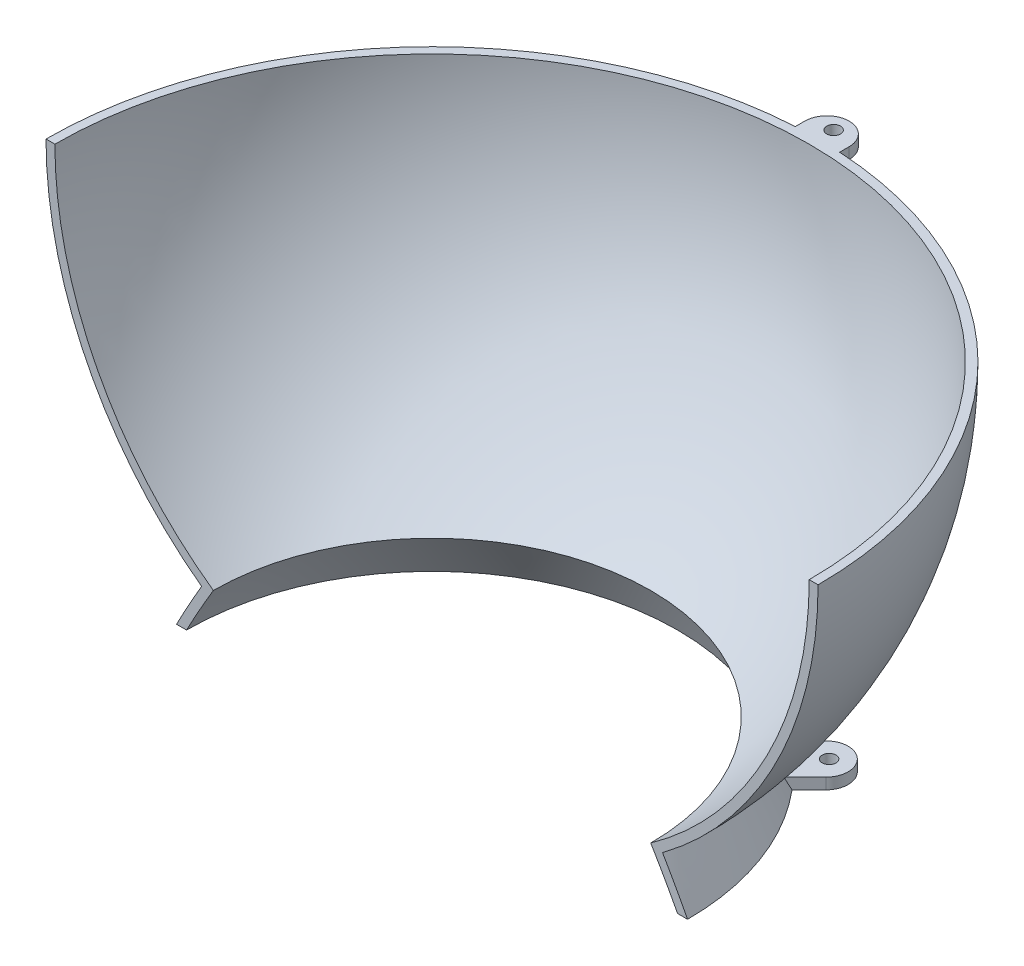
ISO-10303-21;
HEADER;
FILE_DESCRIPTION(('STEP AP214'),'2;1');
FILE_NAME('part.step','',(''),(''),'','','');
FILE_SCHEMA(('AUTOMOTIVE_DESIGN { 1 0 10303 214 1 1 1 1 }'));
ENDSEC;
DATA;
#1=APPLICATION_CONTEXT('core data for automotive mechanical design processes');
#2=APPLICATION_PROTOCOL_DEFINITION('international standard','automotive_design',2000,#1);
#3=PRODUCT_CONTEXT('',#1,'mechanical');
#4=PRODUCT('Part','Part','',(#3));
#5=PRODUCT_RELATED_PRODUCT_CATEGORY('part','',(#4));
#6=PRODUCT_DEFINITION_FORMATION('','',#4);
#7=PRODUCT_DEFINITION_CONTEXT('part definition',#1,'design');
#8=PRODUCT_DEFINITION('design','',#6,#7);
#9=PRODUCT_DEFINITION_SHAPE('','',#8);
#10=(LENGTH_UNIT() NAMED_UNIT(*) SI_UNIT(.MILLI.,.METRE.));
#11=(NAMED_UNIT(*) PLANE_ANGLE_UNIT() SI_UNIT($,.RADIAN.));
#12=(NAMED_UNIT(*) SI_UNIT($,.STERADIAN.) SOLID_ANGLE_UNIT());
#13=UNCERTAINTY_MEASURE_WITH_UNIT(LENGTH_MEASURE(1.E-05),#10,'distance_accuracy_value','');
#14=(GEOMETRIC_REPRESENTATION_CONTEXT(3) GLOBAL_UNCERTAINTY_ASSIGNED_CONTEXT((#13)) GLOBAL_UNIT_ASSIGNED_CONTEXT((#10,
#11,#12)) REPRESENTATION_CONTEXT('',''));
#15=CARTESIAN_POINT('',(0.,0.,0.));
#16=DIRECTION('',(0.,0.,1.));
#17=DIRECTION('',(1.,0.,0.));
#18=AXIS2_PLACEMENT_3D('',#15,#16,#17);
#19=CARTESIAN_POINT('',(0.,0.,0.));
#20=DIRECTION('',(0.,0.,1.));
#21=DIRECTION('',(1.,0.,0.));
#22=AXIS2_PLACEMENT_3D('',#19,#20,#21);
#23=PLANE('',#22);
#24=CARTESIAN_POINT('',(135.,0.,0.));
#25=DIRECTION('',(0.,0.,1.));
#26=DIRECTION('',(1.,0.,0.));
#27=AXIS2_PLACEMENT_3D('',#24,#25,#26);
#28=CIRCLE('',#27,217.);
#29=CARTESIAN_POINT('',(-51.9346598239598,110.201782909808,0.));
#30=VERTEX_POINT('',#29);
#31=CARTESIAN_POINT('',(-57.5850461484482,100.,0.));
#32=VERTEX_POINT('',#31);
#33=EDGE_CURVE('E200',#30,#32,#28,.T.);
#34=ORIENTED_EDGE('',*,*,#33,.T.);
#35=DIRECTION('',(1.,0.,0.));
#36=VECTOR('',#35,1.);
#37=CARTESIAN_POINT('',(6.93889390390723E-13,100.,0.));
#38=LINE('',#37,#36);
#39=CARTESIAN_POINT('',(-55.3286631067424,100.,0.));
#40=VERTEX_POINT('',#39);
#41=EDGE_CURVE('E188',#32,#40,#38,.T.);
#42=ORIENTED_EDGE('',*,*,#41,.T.);
#43=CARTESIAN_POINT('',(135.,0.,0.));
#44=DIRECTION('',(0.,0.,1.));
#45=DIRECTION('',(1.,0.,0.));
#46=AXIS2_PLACEMENT_3D('',#43,#44,#45);
#47=CIRCLE('',#46,215.);
#48=CARTESIAN_POINT('',(-49.2833997941517,110.74578348772,0.));
#49=VERTEX_POINT('',#48);
#50=EDGE_CURVE('E197',#40,#49,#47,.F.);
#51=ORIENTED_EDGE('',*,*,#50,.T.);
#52=CARTESIAN_POINT('',(0.,180.,0.));
#53=DIRECTION('',(0.,0.,1.));
#54=DIRECTION('',(1.,0.,0.));
#55=AXIS2_PLACEMENT_3D('',#52,#53,#54);
#56=CIRCLE('',#55,85.);
#57=CARTESIAN_POINT('',(-85.,180.,0.));
#58=VERTEX_POINT('',#57);
#59=EDGE_CURVE('E214',#49,#58,#56,.F.);
#60=ORIENTED_EDGE('',*,*,#59,.T.);
#61=DIRECTION('',(-1.,0.,0.));
#62=VECTOR('',#61,1.);
#63=CARTESIAN_POINT('',(0.,180.,0.));
#64=LINE('',#63,#62);
#65=CARTESIAN_POINT('',(-87.,180.,0.));
#66=VERTEX_POINT('',#65);
#67=EDGE_CURVE('E440',#58,#66,#64,.T.);
#68=ORIENTED_EDGE('',*,*,#67,.T.);
#69=CARTESIAN_POINT('',(0.,180.,0.));
#70=DIRECTION('',(0.,0.,1.));
#71=DIRECTION('',(1.,0.,0.));
#72=AXIS2_PLACEMENT_3D('',#69,#70,#71);
#73=CIRCLE('',#72,87.);
#74=EDGE_CURVE('E227',#66,#30,#73,.T.);
#75=ORIENTED_EDGE('',*,*,#74,.T.);
#76=EDGE_LOOP('',(#34,#42,#51,#60,#68,#75));
#77=FACE_BOUND('',#76,.T.);
#78=ADVANCED_FACE('F43',(#77),#23,.T.);
#79=CARTESIAN_POINT('',(-135.,0.,0.));
#80=DIRECTION('',(0.,0.,1.));
#81=DIRECTION('',(1.,0.,0.));
#82=AXIS2_PLACEMENT_3D('',#79,#80,#81);
#83=CIRCLE('',#82,215.);
#84=CARTESIAN_POINT('',(49.2833997941517,110.74578348772,0.));
#85=VERTEX_POINT('',#84);
#86=CARTESIAN_POINT('',(55.3286631067432,99.9999999999996,0.));
#87=VERTEX_POINT('',#86);
#88=EDGE_CURVE('E222',#85,#87,#83,.F.);
#89=ORIENTED_EDGE('',*,*,#88,.T.);
#90=CARTESIAN_POINT('',(57.5850461484486,99.9999999999996,0.));
#91=VERTEX_POINT('',#90);
#92=EDGE_CURVE('E58',#87,#91,#38,.T.);
#93=ORIENTED_EDGE('',*,*,#92,.T.);
#94=CARTESIAN_POINT('',(-135.,0.,0.));
#95=DIRECTION('',(0.,0.,1.));
#96=DIRECTION('',(1.,0.,0.));
#97=AXIS2_PLACEMENT_3D('',#94,#95,#96);
#98=CIRCLE('',#97,217.);
#99=CARTESIAN_POINT('',(51.9346598239598,110.201782909808,0.));
#100=VERTEX_POINT('',#99);
#101=EDGE_CURVE('E232',#91,#100,#98,.T.);
#102=ORIENTED_EDGE('',*,*,#101,.T.);
#103=CARTESIAN_POINT('',(87.,180.,0.));
#104=VERTEX_POINT('',#103);
#105=EDGE_CURVE('E228',#100,#104,#73,.T.);
#106=ORIENTED_EDGE('',*,*,#105,.T.);
#107=CARTESIAN_POINT('',(85.,180.,0.));
#108=VERTEX_POINT('',#107);
#109=EDGE_CURVE('E437',#104,#108,#64,.T.);
#110=ORIENTED_EDGE('',*,*,#109,.T.);
#111=EDGE_CURVE('E209',#108,#85,#56,.F.);
#112=ORIENTED_EDGE('',*,*,#111,.T.);
#113=EDGE_LOOP('',(#89,#93,#102,#106,#110,#112));
#114=FACE_BOUND('',#113,.T.);
#115=ADVANCED_FACE('F362',(#114),#23,.T.);
#116=CARTESIAN_POINT('',(44.7431284447289,102.5,-44.7431284447294));
#117=DIRECTION('',(0.,-1.,0.));
#118=DIRECTION('',(1.,0.,0.));
#119=AXIS2_PLACEMENT_3D('',#116,#117,#118);
#120=CYLINDRICAL_SURFACE('',#119,1.55);
#121=CARTESIAN_POINT('',(44.7431284447289,102.5,-44.7431284447294));
#122=DIRECTION('',(0.,-1.,0.));
#123=DIRECTION('',(-1.,0.,0.));
#124=AXIS2_PLACEMENT_3D('',#121,#122,#123);
#125=CIRCLE('',#124,1.55);
#126=CARTESIAN_POINT('',(43.1931284447289,102.5,-44.7431284447294));
#127=VERTEX_POINT('',#126);
#128=EDGE_CURVE('E236',#127,#127,#125,.T.);
#129=ORIENTED_EDGE('',*,*,#128,.F.);
#130=EDGE_LOOP('',(#129));
#131=FACE_BOUND('',#130,.T.);
#132=CARTESIAN_POINT('',(44.7431284447289,99.9999999999997,-44.7431284447294));
#133=DIRECTION('',(0.,-1.,0.));
#134=DIRECTION('',(1.,0.,0.));
#135=AXIS2_PLACEMENT_3D('',#132,#133,#134);
#136=CIRCLE('',#135,1.55);
#137=CARTESIAN_POINT('',(46.2931284447289,99.9999999999997,-44.7431284447294));
#138=VERTEX_POINT('',#137);
#139=EDGE_CURVE('E449',#138,#138,#136,.F.);
#140=ORIENTED_EDGE('',*,*,#139,.F.);
#141=EDGE_LOOP('',(#140));
#142=FACE_BOUND('',#141,.T.);
#143=ADVANCED_FACE('F367',(#131,#142),#120,.F.);
#144=CARTESIAN_POINT('',(44.3895750541356,102.5,-44.3895750541361));
#145=DIRECTION('',(0.,-1.,0.));
#146=DIRECTION('',(1.,0.,0.));
#147=AXIS2_PLACEMENT_3D('',#144,#145,#146);
#148=CYLINDRICAL_SURFACE('',#147,5.);
#149=DIRECTION('',(0.,-1.,0.));
#150=VECTOR('',#149,1.);
#151=CARTESIAN_POINT('',(47.9251089600684,102.5,-47.9251089600689));
#152=LINE('',#151,#150);
#153=CARTESIAN_POINT('',(47.9251089600683,99.9999999999997,-47.9251089600689));
#154=VERTEX_POINT('',#153);
#155=CARTESIAN_POINT('',(47.9251089600684,102.5,-47.9251089600689));
#156=VERTEX_POINT('',#155);
#157=EDGE_CURVE('E241',#154,#156,#152,.F.);
#158=ORIENTED_EDGE('',*,*,#157,.F.);
#159=CARTESIAN_POINT('',(44.3895750541356,99.9999999999997,-44.3895750541361));
#160=DIRECTION('',(0.,-1.,0.));
#161=DIRECTION('',(1.,0.,0.));
#162=AXIS2_PLACEMENT_3D('',#159,#160,#161);
#163=CIRCLE('',#162,5.);
#164=CARTESIAN_POINT('',(40.8540411482029,99.9999999999997,-47.9251089600688));
#165=VERTEX_POINT('',#164);
#166=EDGE_CURVE('E477',#154,#165,#163,.F.);
#167=ORIENTED_EDGE('',*,*,#166,.T.);
#168=DIRECTION('',(0.,-1.,0.));
#169=VECTOR('',#168,1.);
#170=CARTESIAN_POINT('',(40.8540411482029,102.5,-47.9251089600688));
#171=LINE('',#170,#169);
#172=CARTESIAN_POINT('',(40.8540411482029,102.5,-47.9251089600688));
#173=VERTEX_POINT('',#172);
#174=EDGE_CURVE('E413',#173,#165,#171,.T.);
#175=ORIENTED_EDGE('',*,*,#174,.F.);
#176=CARTESIAN_POINT('',(44.3895750541356,102.5,-44.3895750541361));
#177=DIRECTION('',(0.,1.,0.));
#178=DIRECTION('',(-1.,0.,0.));
#179=AXIS2_PLACEMENT_3D('',#176,#177,#178);
#180=CIRCLE('',#179,5.);
#181=EDGE_CURVE('E406',#156,#173,#180,.T.);
#182=ORIENTED_EDGE('',*,*,#181,.F.);
#183=EDGE_LOOP('',(#158,#167,#175,#182));
#184=FACE_BOUND('',#183,.T.);
#185=ADVANCED_FACE('F375',(#184),#148,.T.);
#186=CARTESIAN_POINT('',(44.3895750541356,102.5,-44.3895750541361));
#187=DIRECTION('',(0.,-1.,0.));
#188=DIRECTION('',(1.,0.,0.));
#189=AXIS2_PLACEMENT_3D('',#186,#187,#188);
#190=CYLINDRICAL_SURFACE('',#189,5.);
#191=DIRECTION('',(0.,-1.,0.));
#192=VECTOR('',#191,1.);
#193=CARTESIAN_POINT('',(47.9251089600684,102.5,-40.8540411482034));
#194=LINE('',#193,#192);
#195=CARTESIAN_POINT('',(47.9251089600684,99.9999999999997,-40.8540411482034));
#196=VERTEX_POINT('',#195);
#197=CARTESIAN_POINT('',(47.9251089600684,102.5,-40.8540411482034));
#198=VERTEX_POINT('',#197);
#199=EDGE_CURVE('E403',#196,#198,#194,.F.);
#200=ORIENTED_EDGE('',*,*,#199,.F.);
#201=CARTESIAN_POINT('',(44.3895750541356,99.9999999999997,-44.3895750541361));
#202=DIRECTION('',(0.,-1.,0.));
#203=DIRECTION('',(1.,0.,0.));
#204=AXIS2_PLACEMENT_3D('',#201,#202,#203);
#205=CIRCLE('',#204,5.);
#206=EDGE_CURVE('E480',#196,#154,#205,.F.);
#207=ORIENTED_EDGE('',*,*,#206,.T.);
#208=ORIENTED_EDGE('',*,*,#157,.T.);
#209=CARTESIAN_POINT('',(44.3895750541356,102.5,-44.3895750541361));
#210=DIRECTION('',(0.,1.,0.));
#211=DIRECTION('',(-1.,0.,0.));
#212=AXIS2_PLACEMENT_3D('',#209,#210,#211);
#213=CIRCLE('',#212,5.);
#214=EDGE_CURVE('E409',#198,#156,#213,.T.);
#215=ORIENTED_EDGE('',*,*,#214,.F.);
#216=EDGE_LOOP('',(#200,#207,#208,#215));
#217=FACE_BOUND('',#216,.T.);
#218=ADVANCED_FACE('F541',(#217),#190,.T.);
#219=CARTESIAN_POINT('',(-44.7431284447289,102.5,-44.7431284447294));
#220=DIRECTION('',(0.,-1.,0.));
#221=DIRECTION('',(1.,0.,0.));
#222=AXIS2_PLACEMENT_3D('',#219,#220,#221);
#223=CYLINDRICAL_SURFACE('',#222,1.55);
#224=CARTESIAN_POINT('',(-44.7431284447289,102.5,-44.7431284447294));
#225=DIRECTION('',(0.,-1.,0.));
#226=DIRECTION('',(1.,0.,0.));
#227=AXIS2_PLACEMENT_3D('',#224,#225,#226);
#228=CIRCLE('',#227,1.55);
#229=CARTESIAN_POINT('',(-43.1931284447289,102.5,-44.7431284447294));
#230=VERTEX_POINT('',#229);
#231=EDGE_CURVE('E249',#230,#230,#228,.T.);
#232=ORIENTED_EDGE('',*,*,#231,.F.);
#233=EDGE_LOOP('',(#232));
#234=FACE_BOUND('',#233,.T.);
#235=CARTESIAN_POINT('',(-44.7431284447289,100.,-44.7431284447294));
#236=DIRECTION('',(0.,-1.,0.));
#237=DIRECTION('',(1.,0.,0.));
#238=AXIS2_PLACEMENT_3D('',#235,#236,#237);
#239=CIRCLE('',#238,1.55);
#240=CARTESIAN_POINT('',(-43.1931284447289,100.,-44.7431284447294));
#241=VERTEX_POINT('',#240);
#242=EDGE_CURVE('E497',#241,#241,#239,.F.);
#243=ORIENTED_EDGE('',*,*,#242,.F.);
#244=EDGE_LOOP('',(#243));
#245=FACE_BOUND('',#244,.T.);
#246=ADVANCED_FACE('F544',(#234,#245),#223,.F.);
#247=CARTESIAN_POINT('',(-44.3895750541356,102.5,-44.3895750541361));
#248=DIRECTION('',(0.,-1.,0.));
#249=DIRECTION('',(1.,0.,0.));
#250=AXIS2_PLACEMENT_3D('',#247,#248,#249);
#251=CYLINDRICAL_SURFACE('',#250,5.);
#252=DIRECTION('',(0.,-1.,0.));
#253=VECTOR('',#252,1.);
#254=CARTESIAN_POINT('',(-47.9251089600683,102.5,-47.9251089600689));
#255=LINE('',#254,#253);
#256=CARTESIAN_POINT('',(-47.9251089600683,100.,-47.9251089600689));
#257=VERTEX_POINT('',#256);
#258=CARTESIAN_POINT('',(-47.9251089600683,102.5,-47.9251089600689));
#259=VERTEX_POINT('',#258);
#260=EDGE_CURVE('E235',#257,#259,#255,.F.);
#261=ORIENTED_EDGE('',*,*,#260,.F.);
#262=CARTESIAN_POINT('',(-44.3895750541356,100.,-44.3895750541361));
#263=DIRECTION('',(0.,-1.,0.));
#264=DIRECTION('',(1.,0.,0.));
#265=AXIS2_PLACEMENT_3D('',#262,#263,#264);
#266=CIRCLE('',#265,5.);
#267=CARTESIAN_POINT('',(-47.9251089600684,100.,-40.8540411482034));
#268=VERTEX_POINT('',#267);
#269=EDGE_CURVE('E486',#257,#268,#266,.F.);
#270=ORIENTED_EDGE('',*,*,#269,.T.);
#271=DIRECTION('',(0.,-1.,0.));
#272=VECTOR('',#271,1.);
#273=CARTESIAN_POINT('',(-47.9251089600684,102.5,-40.8540411482034));
#274=LINE('',#273,#272);
#275=CARTESIAN_POINT('',(-47.9251089600684,102.5,-40.8540411482034));
#276=VERTEX_POINT('',#275);
#277=EDGE_CURVE('E425',#276,#268,#274,.T.);
#278=ORIENTED_EDGE('',*,*,#277,.F.);
#279=CARTESIAN_POINT('',(-44.3895750541356,102.5,-44.3895750541361));
#280=DIRECTION('',(0.,1.,0.));
#281=DIRECTION('',(-1.,0.,0.));
#282=AXIS2_PLACEMENT_3D('',#279,#280,#281);
#283=CIRCLE('',#282,5.);
#284=EDGE_CURVE('E66',#259,#276,#283,.T.);
#285=ORIENTED_EDGE('',*,*,#284,.F.);
#286=EDGE_LOOP('',(#261,#270,#278,#285));
#287=FACE_BOUND('',#286,.T.);
#288=ADVANCED_FACE('F45',(#287),#251,.T.);
#289=CARTESIAN_POINT('',(-44.3895750541356,102.5,-44.3895750541361));
#290=DIRECTION('',(0.,-1.,0.));
#291=DIRECTION('',(1.,0.,0.));
#292=AXIS2_PLACEMENT_3D('',#289,#290,#291);
#293=CYLINDRICAL_SURFACE('',#292,5.);
#294=DIRECTION('',(0.,-1.,0.));
#295=VECTOR('',#294,1.);
#296=CARTESIAN_POINT('',(-40.8540411482028,102.5,-47.9251089600688));
#297=LINE('',#296,#295);
#298=CARTESIAN_POINT('',(-40.8540411482029,100.,-47.9251089600688));
#299=VERTEX_POINT('',#298);
#300=CARTESIAN_POINT('',(-40.8540411482028,102.5,-47.9251089600688));
#301=VERTEX_POINT('',#300);
#302=EDGE_CURVE('E417',#299,#301,#297,.F.);
#303=ORIENTED_EDGE('',*,*,#302,.F.);
#304=CARTESIAN_POINT('',(-44.3895750541356,100.,-44.3895750541361));
#305=DIRECTION('',(0.,-1.,0.));
#306=DIRECTION('',(1.,0.,0.));
#307=AXIS2_PLACEMENT_3D('',#304,#305,#306);
#308=CIRCLE('',#307,5.);
#309=EDGE_CURVE('E484',#299,#257,#308,.F.);
#310=ORIENTED_EDGE('',*,*,#309,.T.);
#311=ORIENTED_EDGE('',*,*,#260,.T.);
#312=CARTESIAN_POINT('',(-44.3895750541356,102.5,-44.3895750541361));
#313=DIRECTION('',(0.,1.,0.));
#314=DIRECTION('',(-1.,0.,0.));
#315=AXIS2_PLACEMENT_3D('',#312,#313,#314);
#316=CIRCLE('',#315,5.);
#317=EDGE_CURVE('E422',#301,#259,#316,.T.);
#318=ORIENTED_EDGE('',*,*,#317,.F.);
#319=EDGE_LOOP('',(#303,#310,#311,#318));
#320=FACE_BOUND('',#319,.T.);
#321=ADVANCED_FACE('F547',(#320),#293,.T.);
#322=CARTESIAN_POINT('',(35.9042936798971,102.5,-42.975361491763));
#323=DIRECTION('',(-0.707106781186551,0.,-0.707106781186544));
#324=DIRECTION('',(-0.707106781186544,0.,0.707106781186551));
#325=AXIS2_PLACEMENT_3D('',#322,#323,#324);
#326=PLANE('',#325);
#327=ORIENTED_EDGE('',*,*,#174,.T.);
#328=DIRECTION('',(-0.707106781186544,0.,0.707106781186551));
#329=VECTOR('',#328,1.);
#330=CARTESIAN_POINT('',(35.9042936798971,99.9999999999998,-42.975361491763));
#331=LINE('',#330,#329);
#332=CARTESIAN_POINT('',(37.0294604852894,99.9999999999997,-44.1005282971553));
#333=VERTEX_POINT('',#332);
#334=EDGE_CURVE('E469',#165,#333,#331,.T.);
#335=ORIENTED_EDGE('',*,*,#334,.T.);
#336=CARTESIAN_POINT('',(36.0931834361965,102.5002,-43.1642512480624));
#337=CARTESIAN_POINT('',(36.4080829927804,101.672483120693,-43.4791508046463));
#338=CARTESIAN_POINT('',(36.7191280065031,100.841924679515,-43.790195818369));
#339=CARTESIAN_POINT('',(37.3335089459921,99.1751246794733,-44.404576757858));
#340=CARTESIAN_POINT('',(37.6368448718144,98.338883120652,-44.7079126836804));
#341=CARTESIAN_POINT('',(37.9363262548316,97.4997999999997,-45.0073940666976));
#342=B_SPLINE_CURVE_WITH_KNOTS('',3,(#336,#337,#338,#339,#340,#341),.UNSPECIFIED.,.F.,.F.,(4,2,
4),(0.,2.81956165529873,5.63912329009231),.UNSPECIFIED.);
#343=CARTESIAN_POINT('',(36.0932595253563,102.5,-43.1643273372222));
#344=VERTEX_POINT('',#343);
#345=EDGE_CURVE('E396',#344,#333,#342,.T.);
#346=ORIENTED_EDGE('',*,*,#345,.F.);
#347=DIRECTION('',(0.707106781186544,0.,-0.707106781186551));
#348=VECTOR('',#347,1.);
#349=CARTESIAN_POINT('',(35.9042936798971,102.5,-42.975361491763));
#350=LINE('',#349,#348);
#351=EDGE_CURVE('E240',#344,#173,#350,.T.);
#352=ORIENTED_EDGE('',*,*,#351,.T.);
#353=EDGE_LOOP('',(#327,#335,#346,#352));
#354=FACE_BOUND('',#353,.T.);
#355=ADVANCED_FACE('F383',(#354),#326,.T.);
#356=CARTESIAN_POINT('',(42.9753614917626,102.5,-35.9042936798975));
#357=DIRECTION('',(0.707106781186552,0.,0.707106781186543));
#358=DIRECTION('',(0.707106781186543,0.,-0.707106781186552));
#359=AXIS2_PLACEMENT_3D('',#356,#357,#358);
#360=PLANE('',#359);
#361=CARTESIAN_POINT('',(45.0073940666972,97.4997999999996,-37.9363262548322));
#362=CARTESIAN_POINT('',(44.70791268368,98.3388831206519,-37.6368448718149));
#363=CARTESIAN_POINT('',(44.4045767578576,99.1751246794732,-37.3335089459926));
#364=CARTESIAN_POINT('',(43.7901958183686,100.841924679515,-36.7191280065036));
#365=CARTESIAN_POINT('',(43.4791508046459,101.672483120693,-36.4080829927809));
#366=CARTESIAN_POINT('',(43.164251248062,102.5002,-36.093183436197));
#367=B_SPLINE_CURVE_WITH_KNOTS('',3,(#361,#362,#363,#364,#365,#366),.UNSPECIFIED.,.F.,.F.,(4,2,
4),(0.,2.81956163479357,5.6391232900923),.UNSPECIFIED.);
#368=CARTESIAN_POINT('',(44.1005282971499,99.9999999999997,-37.0294604852849));
#369=VERTEX_POINT('',#368);
#370=CARTESIAN_POINT('',(43.1643273372218,102.5,-36.0932595253568));
#371=VERTEX_POINT('',#370);
#372=EDGE_CURVE('E387',#369,#371,#367,.T.);
#373=ORIENTED_EDGE('',*,*,#372,.F.);
#374=DIRECTION('',(0.707106781186543,0.,-0.707106781186552));
#375=VECTOR('',#374,1.);
#376=CARTESIAN_POINT('',(42.9753614917626,99.9999999999997,-35.9042936798975));
#377=LINE('',#376,#375);
#378=EDGE_CURVE('E565',#369,#196,#377,.T.);
#379=ORIENTED_EDGE('',*,*,#378,.T.);
#380=ORIENTED_EDGE('',*,*,#199,.T.);
#381=DIRECTION('',(-0.707106781186543,0.,0.707106781186552));
#382=VECTOR('',#381,1.);
#383=CARTESIAN_POINT('',(42.9753614917626,102.5,-35.9042936798975));
#384=LINE('',#383,#382);
#385=EDGE_CURVE('E245',#198,#371,#384,.T.);
#386=ORIENTED_EDGE('',*,*,#385,.T.);
#387=EDGE_LOOP('',(#373,#379,#380,#386));
#388=FACE_BOUND('',#387,.T.);
#389=ADVANCED_FACE('F332',(#388),#360,.T.);
#390=CARTESIAN_POINT('',(-42.9753614917626,102.5,-35.9042936798975));
#391=DIRECTION('',(-0.707106781186552,0.,0.707106781186543));
#392=DIRECTION('',(0.707106781186543,0.,0.707106781186552));
#393=AXIS2_PLACEMENT_3D('',#390,#391,#392);
#394=PLANE('',#393);
#395=ORIENTED_EDGE('',*,*,#277,.T.);
#396=DIRECTION('',(0.707106781186543,0.,0.707106781186552));
#397=VECTOR('',#396,1.);
#398=CARTESIAN_POINT('',(-42.9753614917626,100.,-35.9042936798975));
#399=LINE('',#398,#397);
#400=CARTESIAN_POINT('',(-44.1005282971491,100.,-37.0294604852841));
#401=VERTEX_POINT('',#400);
#402=EDGE_CURVE('E562',#268,#401,#399,.T.);
#403=ORIENTED_EDGE('',*,*,#402,.T.);
#404=CARTESIAN_POINT('',(-43.1642512480618,102.5002,-36.0931834361967));
#405=CARTESIAN_POINT('',(-43.4791508046456,101.672483120694,-36.4080829927806));
#406=CARTESIAN_POINT('',(-43.7901958183684,100.841924679515,-36.7191280065033));
#407=CARTESIAN_POINT('',(-44.4045767578574,99.1751246794739,-37.3335089459923));
#408=CARTESIAN_POINT('',(-44.7079126836797,98.3388831206526,-37.6368448718147));
#409=CARTESIAN_POINT('',(-45.007394066697,97.4998000000003,-37.9363262548319));
#410=B_SPLINE_CURVE_WITH_KNOTS('',3,(#404,#405,#406,#407,#408,#409),.UNSPECIFIED.,.F.,.F.,(4,2,
4),(0.,2.81956165529873,5.63912329009229),.UNSPECIFIED.);
#411=CARTESIAN_POINT('',(-43.1643273372216,102.5,-36.0932595253566));
#412=VERTEX_POINT('',#411);
#413=EDGE_CURVE('E304',#412,#401,#410,.T.);
#414=ORIENTED_EDGE('',*,*,#413,.F.);
#415=DIRECTION('',(-0.707106781186543,0.,-0.707106781186552));
#416=VECTOR('',#415,1.);
#417=CARTESIAN_POINT('',(-42.9753614917626,102.5,-35.9042936798975));
#418=LINE('',#417,#416);
#419=EDGE_CURVE('E257',#412,#276,#418,.T.);
#420=ORIENTED_EDGE('',*,*,#419,.T.);
#421=EDGE_LOOP('',(#395,#403,#414,#420));
#422=FACE_BOUND('',#421,.T.);
#423=ADVANCED_FACE('F327',(#422),#394,.T.);
#424=CARTESIAN_POINT('',(-35.904293679897,102.5,-42.975361491763));
#425=DIRECTION('',(0.707106781186551,0.,-0.707106781186544));
#426=DIRECTION('',(-0.707106781186544,0.,-0.707106781186551));
#427=AXIS2_PLACEMENT_3D('',#424,#425,#426);
#428=PLANE('',#427);
#429=CARTESIAN_POINT('',(-37.9363262548315,97.4998000000002,-45.0073940666974));
#430=CARTESIAN_POINT('',(-37.6368448718142,98.3388831206526,-44.7079126836801));
#431=CARTESIAN_POINT('',(-37.3335089459919,99.1751246794738,-44.4045767578578));
#432=CARTESIAN_POINT('',(-36.7191280065028,100.841924679515,-43.7901958183688));
#433=CARTESIAN_POINT('',(-36.4080829927801,101.672483120694,-43.4791508046461));
#434=CARTESIAN_POINT('',(-36.0931834361962,102.5002,-43.1642512480622));
#435=B_SPLINE_CURVE_WITH_KNOTS('',3,(#429,#430,#431,#432,#433,#434),.UNSPECIFIED.,.F.,.F.,(4,2,
4),(0.,2.81956163479356,5.63912329009231),.UNSPECIFIED.);
#436=CARTESIAN_POINT('',(-37.0294604852837,100.,-44.1005282971496));
#437=VERTEX_POINT('',#436);
#438=CARTESIAN_POINT('',(-36.0932595253561,102.5,-43.164327337222));
#439=VERTEX_POINT('',#438);
#440=EDGE_CURVE('E316',#437,#439,#435,.T.);
#441=ORIENTED_EDGE('',*,*,#440,.F.);
#442=DIRECTION('',(-0.707106781186544,0.,-0.707106781186551));
#443=VECTOR('',#442,1.);
#444=CARTESIAN_POINT('',(-35.9042936798971,100.,-42.975361491763));
#445=LINE('',#444,#443);
#446=EDGE_CURVE('E493',#437,#299,#445,.T.);
#447=ORIENTED_EDGE('',*,*,#446,.T.);
#448=ORIENTED_EDGE('',*,*,#302,.T.);
#449=DIRECTION('',(0.707106781186544,0.,0.707106781186551));
#450=VECTOR('',#449,1.);
#451=CARTESIAN_POINT('',(-35.904293679897,102.5,-42.975361491763));
#452=LINE('',#451,#450);
#453=EDGE_CURVE('E253',#301,#439,#452,.T.);
#454=ORIENTED_EDGE('',*,*,#453,.T.);
#455=EDGE_LOOP('',(#441,#447,#448,#454));
#456=FACE_BOUND('',#455,.T.);
#457=ADVANCED_FACE('F331',(#456),#428,.T.);
#458=CARTESIAN_POINT('',(0.,0.,0.));
#459=DIRECTION('',(0.,1.,0.));
#460=DIRECTION('',(0.,0.,1.));
#461=AXIS2_PLACEMENT_3D('',#458,#459,#460);
#462=DEGENERATE_TOROIDAL_SURFACE('',#461,135.,217.,.F.);
#463=CARTESIAN_POINT('',(6.93889390390723E-13,100.,0.));
#464=DIRECTION('',(0.,-1.,0.));
#465=DIRECTION('',(1.,0.,0.));
#466=AXIS2_PLACEMENT_3D('',#463,#464,#465);
#467=CIRCLE('',#466,57.5850461484484);
#468=EDGE_CURVE('E572',#32,#401,#467,.T.);
#469=ORIENTED_EDGE('',*,*,#468,.F.);
#470=ORIENTED_EDGE('',*,*,#33,.F.);
#471=CARTESIAN_POINT('',(0.,110.201782909808,0.));
#472=DIRECTION('',(0.,1.,0.));
#473=DIRECTION('',(0.,0.,1.));
#474=AXIS2_PLACEMENT_3D('',#471,#472,#473);
#475=CIRCLE('',#474,51.9346598239598);
#476=EDGE_CURVE('E273',#100,#30,#475,.T.);
#477=ORIENTED_EDGE('',*,*,#476,.F.);
#478=ORIENTED_EDGE('',*,*,#101,.F.);
#479=EDGE_CURVE('E202',#369,#91,#467,.T.);
#480=ORIENTED_EDGE('',*,*,#479,.F.);
#481=ORIENTED_EDGE('',*,*,#372,.T.);
#482=CARTESIAN_POINT('',(7.37616352985816E-13,102.5,0.));
#483=DIRECTION('',(0.,1.,0.));
#484=DIRECTION('',(-1.,0.,0.));
#485=AXIS2_PLACEMENT_3D('',#482,#483,#484);
#486=CIRCLE('',#485,56.2661757865201);
#487=EDGE_CURVE('E395',#371,#344,#486,.T.);
#488=ORIENTED_EDGE('',*,*,#487,.T.);
#489=ORIENTED_EDGE('',*,*,#345,.T.);
#490=EDGE_CURVE('E462',#437,#333,#467,.T.);
#491=ORIENTED_EDGE('',*,*,#490,.F.);
#492=ORIENTED_EDGE('',*,*,#440,.T.);
#493=CARTESIAN_POINT('',(7.37616352985816E-13,102.5,0.));
#494=DIRECTION('',(0.,1.,0.));
#495=DIRECTION('',(-1.,0.,0.));
#496=AXIS2_PLACEMENT_3D('',#493,#494,#495);
#497=CIRCLE('',#496,56.26617578652);
#498=EDGE_CURVE('E456',#439,#412,#497,.T.);
#499=ORIENTED_EDGE('',*,*,#498,.T.);
#500=ORIENTED_EDGE('',*,*,#413,.T.);
#501=EDGE_LOOP('',(#469,#470,#477,#478,#480,#481,#488,#489,#491,#492,#499,#500));
#502=FACE_BOUND('',#501,.T.);
#503=ADVANCED_FACE('F323',(#502),#462,.F.);
#504=CARTESIAN_POINT('',(0.,0.,0.));
#505=DIRECTION('',(0.,1.,0.));
#506=DIRECTION('',(0.,0.,1.));
#507=AXIS2_PLACEMENT_3D('',#504,#505,#506);
#508=DEGENERATE_TOROIDAL_SURFACE('',#507,135.,215.,.F.);
#509=CARTESIAN_POINT('',(6.93889390390723E-13,100.,0.));
#510=DIRECTION('',(0.,-1.,0.));
#511=DIRECTION('',(1.,0.,0.));
#512=AXIS2_PLACEMENT_3D('',#509,#510,#511);
#513=CIRCLE('',#512,55.3286631067428);
#514=EDGE_CURVE('E11',#87,#40,#513,.F.);
#515=ORIENTED_EDGE('',*,*,#514,.F.);
#516=ORIENTED_EDGE('',*,*,#88,.F.);
#517=CARTESIAN_POINT('',(0.,110.74578348772,0.));
#518=DIRECTION('',(0.,1.,0.));
#519=DIRECTION('',(0.,0.,1.));
#520=AXIS2_PLACEMENT_3D('',#517,#518,#519);
#521=CIRCLE('',#520,49.2833997941517);
#522=EDGE_CURVE('E207',#85,#49,#521,.T.);
#523=ORIENTED_EDGE('',*,*,#522,.T.);
#524=ORIENTED_EDGE('',*,*,#50,.F.);
#525=EDGE_LOOP('',(#515,#516,#523,#524));
#526=FACE_BOUND('',#525,.T.);
#527=ADVANCED_FACE('F205',(#526),#508,.T.);
#528=CARTESIAN_POINT('',(0.,177.5,-89.));
#529=DIRECTION('',(0.,1.,0.));
#530=DIRECTION('',(0.,0.,1.));
#531=AXIS2_PLACEMENT_3D('',#528,#529,#530);
#532=CYLINDRICAL_SURFACE('',#531,5.);
#533=DIRECTION('',(0.,1.,0.));
#534=VECTOR('',#533,1.);
#535=CARTESIAN_POINT('',(0.,177.5,-94.));
#536=LINE('',#535,#534);
#537=CARTESIAN_POINT('',(0.,180.,-94.));
#538=VERTEX_POINT('',#537);
#539=CARTESIAN_POINT('',(0.,177.5,-94.));
#540=VERTEX_POINT('',#539);
#541=EDGE_CURVE('E260',#538,#540,#536,.F.);
#542=ORIENTED_EDGE('',*,*,#541,.F.);
#543=CARTESIAN_POINT('',(0.,180.,-89.));
#544=DIRECTION('',(0.,1.,0.));
#545=DIRECTION('',(0.,0.,1.));
#546=AXIS2_PLACEMENT_3D('',#543,#544,#545);
#547=CIRCLE('',#546,5.);
#548=CARTESIAN_POINT('',(5.,180.,-89.));
#549=VERTEX_POINT('',#548);
#550=EDGE_CURVE('E217',#538,#549,#547,.F.);
#551=ORIENTED_EDGE('',*,*,#550,.T.);
#552=DIRECTION('',(0.,1.,0.));
#553=VECTOR('',#552,1.);
#554=CARTESIAN_POINT('',(5.,177.5,-89.));
#555=LINE('',#554,#553);
#556=CARTESIAN_POINT('',(5.,177.5,-89.));
#557=VERTEX_POINT('',#556);
#558=EDGE_CURVE('E300',#557,#549,#555,.T.);
#559=ORIENTED_EDGE('',*,*,#558,.F.);
#560=CARTESIAN_POINT('',(0.,177.5,-89.));
#561=DIRECTION('',(0.,1.,0.));
#562=DIRECTION('',(0.,0.,1.));
#563=AXIS2_PLACEMENT_3D('',#560,#561,#562);
#564=CIRCLE('',#563,5.);
#565=EDGE_CURVE('E293',#540,#557,#564,.F.);
#566=ORIENTED_EDGE('',*,*,#565,.F.);
#567=EDGE_LOOP('',(#542,#551,#559,#566));
#568=FACE_BOUND('',#567,.T.);
#569=ADVANCED_FACE('F523',(#568),#532,.T.);
#570=CARTESIAN_POINT('',(0.,177.5,-89.));
#571=DIRECTION('',(0.,1.,0.));
#572=DIRECTION('',(0.,0.,1.));
#573=AXIS2_PLACEMENT_3D('',#570,#571,#572);
#574=CYLINDRICAL_SURFACE('',#573,5.);
#575=DIRECTION('',(0.,1.,0.));
#576=VECTOR('',#575,1.);
#577=CARTESIAN_POINT('',(-5.,177.5,-89.));
#578=LINE('',#577,#576);
#579=CARTESIAN_POINT('',(-5.,180.,-89.));
#580=VERTEX_POINT('',#579);
#581=CARTESIAN_POINT('',(-5.,177.5,-89.));
#582=VERTEX_POINT('',#581);
#583=EDGE_CURVE('E290',#580,#582,#578,.F.);
#584=ORIENTED_EDGE('',*,*,#583,.F.);
#585=CARTESIAN_POINT('',(0.,180.,-89.));
#586=DIRECTION('',(0.,1.,0.));
#587=DIRECTION('',(0.,0.,1.));
#588=AXIS2_PLACEMENT_3D('',#585,#586,#587);
#589=CIRCLE('',#588,5.);
#590=EDGE_CURVE('E515',#580,#538,#589,.F.);
#591=ORIENTED_EDGE('',*,*,#590,.T.);
#592=ORIENTED_EDGE('',*,*,#541,.T.);
#593=CARTESIAN_POINT('',(0.,177.5,-89.));
#594=DIRECTION('',(0.,1.,0.));
#595=DIRECTION('',(0.,0.,1.));
#596=AXIS2_PLACEMENT_3D('',#593,#594,#595);
#597=CIRCLE('',#596,5.);
#598=EDGE_CURVE('E296',#582,#540,#597,.F.);
#599=ORIENTED_EDGE('',*,*,#598,.F.);
#600=EDGE_LOOP('',(#584,#591,#592,#599));
#601=FACE_BOUND('',#600,.T.);
#602=ADVANCED_FACE('F344',(#601),#574,.T.);
#603=CARTESIAN_POINT('',(0.,177.5,-90.5));
#604=DIRECTION('',(0.,1.,0.));
#605=DIRECTION('',(0.,0.,1.));
#606=AXIS2_PLACEMENT_3D('',#603,#604,#605);
#607=CYLINDRICAL_SURFACE('',#606,1.54999999999999);
#608=CARTESIAN_POINT('',(0.,177.5,-90.5));
#609=DIRECTION('',(0.,1.,0.));
#610=DIRECTION('',(0.,0.,1.));
#611=AXIS2_PLACEMENT_3D('',#608,#609,#610);
#612=CIRCLE('',#611,1.54999999999999);
#613=CARTESIAN_POINT('',(0.,177.5,-88.95));
#614=VERTEX_POINT('',#613);
#615=EDGE_CURVE('E261',#614,#614,#612,.T.);
#616=ORIENTED_EDGE('',*,*,#615,.F.);
#617=EDGE_LOOP('',(#616));
#618=FACE_BOUND('',#617,.T.);
#619=CARTESIAN_POINT('',(0.,180.,-90.5));
#620=DIRECTION('',(0.,1.,0.));
#621=DIRECTION('',(0.,0.,1.));
#622=AXIS2_PLACEMENT_3D('',#619,#620,#621);
#623=CIRCLE('',#622,1.54999999999999);
#624=CARTESIAN_POINT('',(0.,180.,-88.95));
#625=VERTEX_POINT('',#624);
#626=EDGE_CURVE('E210',#625,#625,#623,.F.);
#627=ORIENTED_EDGE('',*,*,#626,.F.);
#628=EDGE_LOOP('',(#627));
#629=FACE_BOUND('',#628,.T.);
#630=ADVANCED_FACE('F340',(#618,#629),#607,.F.);
#631=CARTESIAN_POINT('',(-5.,177.5,-94.));
#632=DIRECTION('',(-1.,0.,0.));
#633=DIRECTION('',(0.,0.,1.));
#634=AXIS2_PLACEMENT_3D('',#631,#632,#633);
#635=PLANE('',#634);
#636=CARTESIAN_POINT('',(-5.,180.,0.));
#637=DIRECTION('',(-1.,0.,0.));
#638=DIRECTION('',(0.,0.,1.));
#639=AXIS2_PLACEMENT_3D('',#636,#637,#638);
#640=CIRCLE('',#639,86.8562030024339);
#641=CARTESIAN_POINT('',(-5.,180.,-86.8562030024339));
#642=VERTEX_POINT('',#641);
#643=CARTESIAN_POINT('',(-5.,177.5,-86.8202165396978));
#644=VERTEX_POINT('',#643);
#645=EDGE_CURVE('E283',#642,#644,#640,.T.);
#646=ORIENTED_EDGE('',*,*,#645,.F.);
#647=DIRECTION('',(0.,0.,-1.));
#648=VECTOR('',#647,1.);
#649=CARTESIAN_POINT('',(-5.,180.,-94.));
#650=LINE('',#649,#648);
#651=EDGE_CURVE('E511',#642,#580,#650,.T.);
#652=ORIENTED_EDGE('',*,*,#651,.T.);
#653=ORIENTED_EDGE('',*,*,#583,.T.);
#654=DIRECTION('',(0.,0.,1.));
#655=VECTOR('',#654,1.);
#656=CARTESIAN_POINT('',(-5.,177.5,-94.));
#657=LINE('',#656,#655);
#658=EDGE_CURVE('E265',#582,#644,#657,.T.);
#659=ORIENTED_EDGE('',*,*,#658,.T.);
#660=EDGE_LOOP('',(#646,#652,#653,#659));
#661=FACE_BOUND('',#660,.T.);
#662=ADVANCED_FACE('F343',(#661),#635,.T.);
#663=CARTESIAN_POINT('',(5.,177.5,-94.));
#664=DIRECTION('',(1.,0.,0.));
#665=DIRECTION('',(0.,0.,-1.));
#666=AXIS2_PLACEMENT_3D('',#663,#664,#665);
#667=PLANE('',#666);
#668=ORIENTED_EDGE('',*,*,#558,.T.);
#669=DIRECTION('',(0.,0.,1.));
#670=VECTOR('',#669,1.);
#671=CARTESIAN_POINT('',(5.,180.,-94.));
#672=LINE('',#671,#670);
#673=CARTESIAN_POINT('',(5.,180.,-86.8562030024339));
#674=VERTEX_POINT('',#673);
#675=EDGE_CURVE('E507',#549,#674,#672,.T.);
#676=ORIENTED_EDGE('',*,*,#675,.T.);
#677=CARTESIAN_POINT('',(5.00000000000001,180.,0.));
#678=DIRECTION('',(1.,0.,0.));
#679=DIRECTION('',(0.,0.,-1.));
#680=AXIS2_PLACEMENT_3D('',#677,#678,#679);
#681=CIRCLE('',#680,86.8562030024339);
#682=CARTESIAN_POINT('',(5.,177.5,-86.8202165396978));
#683=VERTEX_POINT('',#682);
#684=EDGE_CURVE('E279',#683,#674,#681,.T.);
#685=ORIENTED_EDGE('',*,*,#684,.F.);
#686=DIRECTION('',(0.,0.,-1.));
#687=VECTOR('',#686,1.);
#688=CARTESIAN_POINT('',(5.,177.5,-94.));
#689=LINE('',#688,#687);
#690=EDGE_CURVE('E269',#683,#557,#689,.T.);
#691=ORIENTED_EDGE('',*,*,#690,.T.);
#692=EDGE_LOOP('',(#668,#676,#685,#691));
#693=FACE_BOUND('',#692,.T.);
#694=ADVANCED_FACE('F352',(#693),#667,.T.);
#695=CARTESIAN_POINT('',(0.,180.,0.));
#696=DIRECTION('',(0.,1.,0.));
#697=DIRECTION('',(0.,0.,-1.));
#698=AXIS2_PLACEMENT_3D('',#695,#696,#697);
#699=SPHERICAL_SURFACE('',#698,87.);
#700=CARTESIAN_POINT('',(0.,180.,0.));
#701=DIRECTION('',(0.,1.,0.));
#702=DIRECTION('',(0.,0.,1.));
#703=AXIS2_PLACEMENT_3D('',#700,#701,#702);
#704=CIRCLE('',#703,87.);
#705=EDGE_CURVE('E506',#104,#674,#704,.T.);
#706=ORIENTED_EDGE('',*,*,#705,.F.);
#707=ORIENTED_EDGE('',*,*,#105,.F.);
#708=ORIENTED_EDGE('',*,*,#476,.T.);
#709=ORIENTED_EDGE('',*,*,#74,.F.);
#710=EDGE_CURVE('E445',#642,#66,#704,.T.);
#711=ORIENTED_EDGE('',*,*,#710,.F.);
#712=ORIENTED_EDGE('',*,*,#645,.T.);
#713=CARTESIAN_POINT('',(0.,177.5,0.));
#714=DIRECTION('',(0.,1.,0.));
#715=DIRECTION('',(0.,0.,1.));
#716=AXIS2_PLACEMENT_3D('',#713,#714,#715);
#717=CIRCLE('',#716,86.9640730416878);
#718=EDGE_CURVE('E286',#683,#644,#717,.T.);
#719=ORIENTED_EDGE('',*,*,#718,.F.);
#720=ORIENTED_EDGE('',*,*,#684,.T.);
#721=EDGE_LOOP('',(#706,#707,#708,#709,#711,#712,#719,#720));
#722=FACE_BOUND('',#721,.T.);
#723=ADVANCED_FACE('F354',(#722),#699,.T.);
#724=CARTESIAN_POINT('',(0.,180.,0.));
#725=DIRECTION('',(0.,1.,0.));
#726=DIRECTION('',(0.,0.,-1.));
#727=AXIS2_PLACEMENT_3D('',#724,#725,#726);
#728=SPHERICAL_SURFACE('',#727,85.);
#729=CARTESIAN_POINT('',(0.,180.,0.));
#730=DIRECTION('',(0.,1.,0.));
#731=DIRECTION('',(0.,0.,1.));
#732=AXIS2_PLACEMENT_3D('',#729,#730,#731);
#733=CIRCLE('',#732,85.);
#734=EDGE_CURVE('E52',#58,#108,#733,.F.);
#735=ORIENTED_EDGE('',*,*,#734,.F.);
#736=ORIENTED_EDGE('',*,*,#59,.F.);
#737=ORIENTED_EDGE('',*,*,#522,.F.);
#738=ORIENTED_EDGE('',*,*,#111,.F.);
#739=EDGE_LOOP('',(#735,#736,#737,#738));
#740=FACE_BOUND('',#739,.T.);
#741=ADVANCED_FACE('F350',(#740),#728,.F.);
#742=CARTESIAN_POINT('',(0.,177.5,0.));
#743=DIRECTION('',(0.,1.,0.));
#744=DIRECTION('',(0.,0.,1.));
#745=AXIS2_PLACEMENT_3D('',#742,#743,#744);
#746=PLANE('',#745);
#747=ORIENTED_EDGE('',*,*,#615,.T.);
#748=EDGE_LOOP('',(#747));
#749=FACE_BOUND('',#748,.T.);
#750=ORIENTED_EDGE('',*,*,#658,.F.);
#751=ORIENTED_EDGE('',*,*,#598,.T.);
#752=ORIENTED_EDGE('',*,*,#565,.T.);
#753=ORIENTED_EDGE('',*,*,#690,.F.);
#754=ORIENTED_EDGE('',*,*,#718,.T.);
#755=EDGE_LOOP('',(#750,#751,#752,#753,#754));
#756=FACE_BOUND('',#755,.T.);
#757=ADVANCED_FACE('F346',(#749,#756),#746,.F.);
#758=CARTESIAN_POINT('',(7.3708311692428E-13,102.5,0.));
#759=DIRECTION('',(0.,1.,0.));
#760=DIRECTION('',(-1.,0.,0.));
#761=AXIS2_PLACEMENT_3D('',#758,#759,#760);
#762=PLANE('',#761);
#763=ORIENTED_EDGE('',*,*,#385,.F.);
#764=ORIENTED_EDGE('',*,*,#214,.T.);
#765=ORIENTED_EDGE('',*,*,#181,.T.);
#766=ORIENTED_EDGE('',*,*,#351,.F.);
#767=ORIENTED_EDGE('',*,*,#487,.F.);
#768=EDGE_LOOP('',(#763,#764,#765,#766,#767));
#769=FACE_BOUND('',#768,.T.);
#770=ORIENTED_EDGE('',*,*,#128,.T.);
#771=EDGE_LOOP('',(#770));
#772=FACE_BOUND('',#771,.T.);
#773=ADVANCED_FACE('F349',(#769,#772),#762,.T.);
#774=CARTESIAN_POINT('',(7.3708311692428E-13,102.5,0.));
#775=DIRECTION('',(0.,1.,0.));
#776=DIRECTION('',(-1.,0.,0.));
#777=AXIS2_PLACEMENT_3D('',#774,#775,#776);
#778=PLANE('',#777);
#779=ORIENTED_EDGE('',*,*,#453,.F.);
#780=ORIENTED_EDGE('',*,*,#317,.T.);
#781=ORIENTED_EDGE('',*,*,#284,.T.);
#782=ORIENTED_EDGE('',*,*,#419,.F.);
#783=ORIENTED_EDGE('',*,*,#498,.F.);
#784=EDGE_LOOP('',(#779,#780,#781,#782,#783));
#785=FACE_BOUND('',#784,.T.);
#786=ORIENTED_EDGE('',*,*,#231,.T.);
#787=EDGE_LOOP('',(#786));
#788=FACE_BOUND('',#787,.T.);
#789=ADVANCED_FACE('F334',(#785,#788),#778,.T.);
#790=CARTESIAN_POINT('',(0.,180.,0.));
#791=DIRECTION('',(0.,1.,0.));
#792=DIRECTION('',(0.,0.,1.));
#793=AXIS2_PLACEMENT_3D('',#790,#791,#792);
#794=PLANE('',#793);
#795=ORIENTED_EDGE('',*,*,#590,.F.);
#796=ORIENTED_EDGE('',*,*,#651,.F.);
#797=ORIENTED_EDGE('',*,*,#710,.T.);
#798=ORIENTED_EDGE('',*,*,#67,.F.);
#799=ORIENTED_EDGE('',*,*,#734,.T.);
#800=ORIENTED_EDGE('',*,*,#109,.F.);
#801=ORIENTED_EDGE('',*,*,#705,.T.);
#802=ORIENTED_EDGE('',*,*,#675,.F.);
#803=ORIENTED_EDGE('',*,*,#550,.F.);
#804=EDGE_LOOP('',(#795,#796,#797,#798,#799,#800,#801,#802,#803));
#805=FACE_BOUND('',#804,.T.);
#806=ORIENTED_EDGE('',*,*,#626,.T.);
#807=EDGE_LOOP('',(#806));
#808=FACE_BOUND('',#807,.T.);
#809=ADVANCED_FACE('F371',(#805,#808),#794,.T.);
#810=CARTESIAN_POINT('',(6.93889390390723E-13,100.,0.));
#811=DIRECTION('',(0.,-1.,0.));
#812=DIRECTION('',(1.,0.,0.));
#813=AXIS2_PLACEMENT_3D('',#810,#811,#812);
#814=PLANE('',#813);
#815=ORIENTED_EDGE('',*,*,#490,.T.);
#816=ORIENTED_EDGE('',*,*,#334,.F.);
#817=ORIENTED_EDGE('',*,*,#166,.F.);
#818=ORIENTED_EDGE('',*,*,#206,.F.);
#819=ORIENTED_EDGE('',*,*,#378,.F.);
#820=ORIENTED_EDGE('',*,*,#479,.T.);
#821=ORIENTED_EDGE('',*,*,#92,.F.);
#822=ORIENTED_EDGE('',*,*,#514,.T.);
#823=ORIENTED_EDGE('',*,*,#41,.F.);
#824=ORIENTED_EDGE('',*,*,#468,.T.);
#825=ORIENTED_EDGE('',*,*,#402,.F.);
#826=ORIENTED_EDGE('',*,*,#269,.F.);
#827=ORIENTED_EDGE('',*,*,#309,.F.);
#828=ORIENTED_EDGE('',*,*,#446,.F.);
#829=EDGE_LOOP('',(#815,#816,#817,#818,#819,#820,#821,#822,#823,#824,#825,#826,#827,#828));
#830=FACE_BOUND('',#829,.T.);
#831=ORIENTED_EDGE('',*,*,#242,.T.);
#832=EDGE_LOOP('',(#831));
#833=FACE_BOUND('',#832,.T.);
#834=ORIENTED_EDGE('',*,*,#139,.T.);
#835=EDGE_LOOP('',(#834));
#836=FACE_BOUND('',#835,.T.);
#837=ADVANCED_FACE('F186',(#830,#833,#836),#814,.T.);
#838=CLOSED_SHELL('',(#78,#115,#143,#185,#218,#246,#288,#321,#355,#389,#423,#457,#503,#527,#569,
#602,#630,#662,#694,#723,#741,#757,#773,#789,#809,#837));
#839=MANIFOLD_SOLID_BREP('B2',#838);
#840=ADVANCED_BREP_SHAPE_REPRESENTATION('',(#18,#839),#14);
#841=SHAPE_DEFINITION_REPRESENTATION(#9,#840);
ENDSEC;
END-ISO-10303-21;
